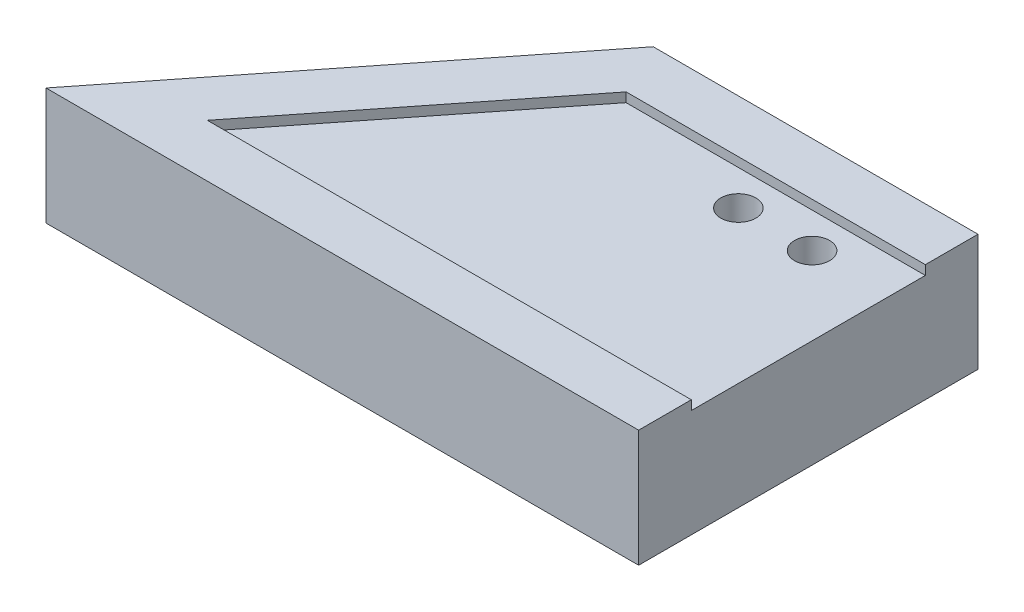
ISO-10303-21;
HEADER;
FILE_DESCRIPTION(('STEP AP214'),'2;1');
FILE_NAME('part.step','',(''),(''),'','','');
FILE_SCHEMA(('AUTOMOTIVE_DESIGN { 1 0 10303 214 1 1 1 1 }'));
ENDSEC;
DATA;
#1=APPLICATION_CONTEXT('core data for automotive mechanical design processes');
#2=APPLICATION_PROTOCOL_DEFINITION('international standard','automotive_design',2000,#1);
#3=PRODUCT_CONTEXT('',#1,'mechanical');
#4=PRODUCT('Part','Part','',(#3));
#5=PRODUCT_RELATED_PRODUCT_CATEGORY('part','',(#4));
#6=PRODUCT_DEFINITION_FORMATION('','',#4);
#7=PRODUCT_DEFINITION_CONTEXT('part definition',#1,'design');
#8=PRODUCT_DEFINITION('design','',#6,#7);
#9=PRODUCT_DEFINITION_SHAPE('','',#8);
#10=(LENGTH_UNIT() NAMED_UNIT(*) SI_UNIT(.MILLI.,.METRE.));
#11=(NAMED_UNIT(*) PLANE_ANGLE_UNIT() SI_UNIT($,.RADIAN.));
#12=(NAMED_UNIT(*) SI_UNIT($,.STERADIAN.) SOLID_ANGLE_UNIT());
#13=UNCERTAINTY_MEASURE_WITH_UNIT(LENGTH_MEASURE(1.E-05),#10,'distance_accuracy_value','');
#14=(GEOMETRIC_REPRESENTATION_CONTEXT(3) GLOBAL_UNCERTAINTY_ASSIGNED_CONTEXT((#13)) GLOBAL_UNIT_ASSIGNED_CONTEXT((#10,
#11,#12)) REPRESENTATION_CONTEXT('',''));
#15=CARTESIAN_POINT('',(0.,0.,0.));
#16=DIRECTION('',(0.,0.,1.));
#17=DIRECTION('',(1.,0.,0.));
#18=AXIS2_PLACEMENT_3D('',#15,#16,#17);
#19=CARTESIAN_POINT('',(0.,0.,0.));
#20=DIRECTION('',(0.,1.,0.));
#21=DIRECTION('',(0.,0.,1.));
#22=AXIS2_PLACEMENT_3D('',#19,#20,#21);
#23=PLANE('',#22);
#24=CARTESIAN_POINT('',(27.35,0.,-16.5));
#25=DIRECTION('',(0.,-1.,0.));
#26=DIRECTION('',(0.,0.,-1.));
#27=AXIS2_PLACEMENT_3D('',#24,#25,#26);
#28=CIRCLE('',#27,1.5);
#29=CARTESIAN_POINT('',(27.35,0.,-18.));
#30=VERTEX_POINT('',#29);
#31=EDGE_CURVE('E262',#30,#30,#28,.T.);
#32=ORIENTED_EDGE('',*,*,#31,.F.);
#33=EDGE_LOOP('',(#32));
#34=FACE_BOUND('',#33,.T.);
#35=CARTESIAN_POINT('',(33.65,0.,-16.5));
#36=DIRECTION('',(0.,-1.,0.));
#37=DIRECTION('',(0.,0.,-1.));
#38=AXIS2_PLACEMENT_3D('',#35,#36,#37);
#39=CIRCLE('',#38,1.5);
#40=CARTESIAN_POINT('',(33.65,0.,-18.));
#41=VERTEX_POINT('',#40);
#42=EDGE_CURVE('E261',#41,#41,#39,.T.);
#43=ORIENTED_EDGE('',*,*,#42,.F.);
#44=EDGE_LOOP('',(#43));
#45=FACE_BOUND('',#44,.T.);
#46=DIRECTION('',(-1.,0.,0.));
#47=VECTOR('',#46,1.);
#48=CARTESIAN_POINT('',(0.,0.,-24.));
#49=LINE('',#48,#47);
#50=CARTESIAN_POINT('',(40.3302122674418,0.,-24.));
#51=VERTEX_POINT('',#50);
#52=CARTESIAN_POINT('',(12.5769902963631,0.,-24.));
#53=VERTEX_POINT('',#52);
#54=EDGE_CURVE('E240',#51,#53,#49,.T.);
#55=ORIENTED_EDGE('',*,*,#54,.F.);
#56=DIRECTION('',(0.,0.,-1.));
#57=VECTOR('',#56,1.);
#58=CARTESIAN_POINT('',(40.3302122674418,0.,5.));
#59=LINE('',#58,#57);
#60=CARTESIAN_POINT('',(40.3302122674418,0.,5.));
#61=VERTEX_POINT('',#60);
#62=EDGE_CURVE('E254',#61,#51,#59,.T.);
#63=ORIENTED_EDGE('',*,*,#62,.F.);
#64=DIRECTION('',(1.,0.,0.));
#65=VECTOR('',#64,1.);
#66=CARTESIAN_POINT('',(0.,0.,5.));
#67=LINE('',#66,#65);
#68=CARTESIAN_POINT('',(-10.3177465457422,0.,5.));
#69=VERTEX_POINT('',#68);
#70=EDGE_CURVE('E225',#69,#61,#67,.T.);
#71=ORIENTED_EDGE('',*,*,#70,.F.);
#72=DIRECTION('',(-0.619644288579021,0.,0.784882765533426));
#73=VECTOR('',#72,1.);
#74=CARTESIAN_POINT('',(-3.92441382766714,0.,-3.09822144289511));
#75=LINE('',#74,#73);
#76=EDGE_CURVE('E242',#53,#69,#75,.T.);
#77=ORIENTED_EDGE('',*,*,#76,.F.);
#78=EDGE_LOOP('',(#55,#63,#71,#77));
#79=FACE_BOUND('',#78,.T.);
#80=ADVANCED_FACE('F142',(#34,#45,#79),#23,.F.);
#81=CARTESIAN_POINT('',(0.,10.,-24.));
#82=DIRECTION('',(0.,0.,1.));
#83=DIRECTION('',(1.,0.,0.));
#84=AXIS2_PLACEMENT_3D('',#81,#82,#83);
#85=PLANE('',#84);
#86=DIRECTION('',(-1.,0.,0.));
#87=VECTOR('',#86,1.);
#88=CARTESIAN_POINT('',(0.,10.,-24.));
#89=LINE('',#88,#87);
#90=CARTESIAN_POINT('',(40.3302122674418,10.,-24.));
#91=VERTEX_POINT('',#90);
#92=CARTESIAN_POINT('',(12.5769902963631,10.,-24.));
#93=VERTEX_POINT('',#92);
#94=EDGE_CURVE('E236',#91,#93,#89,.T.);
#95=ORIENTED_EDGE('',*,*,#94,.F.);
#96=DIRECTION('',(0.,-1.,0.));
#97=VECTOR('',#96,1.);
#98=CARTESIAN_POINT('',(40.3302122674418,10.,-24.));
#99=LINE('',#98,#97);
#100=EDGE_CURVE('E226',#91,#51,#99,.T.);
#101=ORIENTED_EDGE('',*,*,#100,.T.);
#102=ORIENTED_EDGE('',*,*,#54,.T.);
#103=DIRECTION('',(0.,-1.,0.));
#104=VECTOR('',#103,1.);
#105=CARTESIAN_POINT('',(12.5769902963631,10.,-24.));
#106=LINE('',#105,#104);
#107=EDGE_CURVE('E150',#93,#53,#106,.T.);
#108=ORIENTED_EDGE('',*,*,#107,.F.);
#109=EDGE_LOOP('',(#95,#101,#102,#108));
#110=FACE_BOUND('',#109,.T.);
#111=ADVANCED_FACE('F144',(#110),#85,.F.);
#112=CARTESIAN_POINT('',(-3.92441382766714,10.,-3.09822144289511));
#113=DIRECTION('',(0.784882765533426,0.,0.619644288579021));
#114=DIRECTION('',(0.619644288579021,0.,-0.784882765533426));
#115=AXIS2_PLACEMENT_3D('',#112,#113,#114);
#116=PLANE('',#115);
#117=ORIENTED_EDGE('',*,*,#76,.T.);
#118=DIRECTION('',(0.,-1.,0.));
#119=VECTOR('',#118,1.);
#120=CARTESIAN_POINT('',(-10.3177465457422,10.,5.));
#121=LINE('',#120,#119);
#122=CARTESIAN_POINT('',(-10.3177465457422,10.,5.));
#123=VERTEX_POINT('',#122);
#124=EDGE_CURVE('E233',#123,#69,#121,.T.);
#125=ORIENTED_EDGE('',*,*,#124,.F.);
#126=DIRECTION('',(-0.619644288579021,0.,0.784882765533426));
#127=VECTOR('',#126,1.);
#128=CARTESIAN_POINT('',(-3.92441382766714,10.,-3.09822144289511));
#129=LINE('',#128,#127);
#130=EDGE_CURVE('E231',#93,#123,#129,.T.);
#131=ORIENTED_EDGE('',*,*,#130,.F.);
#132=ORIENTED_EDGE('',*,*,#107,.T.);
#133=EDGE_LOOP('',(#117,#125,#131,#132));
#134=FACE_BOUND('',#133,.T.);
#135=ADVANCED_FACE('F249',(#134),#116,.F.);
#136=CARTESIAN_POINT('',(0.,10.,5.));
#137=DIRECTION('',(0.,0.,-1.));
#138=DIRECTION('',(-1.,0.,0.));
#139=AXIS2_PLACEMENT_3D('',#136,#137,#138);
#140=PLANE('',#139);
#141=ORIENTED_EDGE('',*,*,#70,.T.);
#142=DIRECTION('',(0.,-1.,0.));
#143=VECTOR('',#142,1.);
#144=CARTESIAN_POINT('',(40.3302122674418,10.,5.));
#145=LINE('',#144,#143);
#146=CARTESIAN_POINT('',(40.3302122674418,10.,5.));
#147=VERTEX_POINT('',#146);
#148=EDGE_CURVE('E208',#147,#61,#145,.T.);
#149=ORIENTED_EDGE('',*,*,#148,.F.);
#150=DIRECTION('',(1.,0.,0.));
#151=VECTOR('',#150,1.);
#152=CARTESIAN_POINT('',(0.,10.,5.));
#153=LINE('',#152,#151);
#154=EDGE_CURVE('E223',#123,#147,#153,.T.);
#155=ORIENTED_EDGE('',*,*,#154,.F.);
#156=ORIENTED_EDGE('',*,*,#124,.T.);
#157=EDGE_LOOP('',(#141,#149,#155,#156));
#158=FACE_BOUND('',#157,.T.);
#159=ADVANCED_FACE('F221',(#158),#140,.F.);
#160=CARTESIAN_POINT('',(0.,10.,0.));
#161=DIRECTION('',(0.,1.,0.));
#162=DIRECTION('',(0.,0.,1.));
#163=AXIS2_PLACEMENT_3D('',#160,#161,#162);
#164=PLANE('',#163);
#165=DIRECTION('',(0.,0.,-1.));
#166=VECTOR('',#165,1.);
#167=CARTESIAN_POINT('',(40.3302122674418,10.,5.));
#168=LINE('',#167,#166);
#169=CARTESIAN_POINT('',(40.3302122674418,10.,-19.5));
#170=VERTEX_POINT('',#169);
#171=EDGE_CURVE('E216',#170,#91,#168,.T.);
#172=ORIENTED_EDGE('',*,*,#171,.T.);
#173=ORIENTED_EDGE('',*,*,#94,.T.);
#174=ORIENTED_EDGE('',*,*,#130,.T.);
#175=ORIENTED_EDGE('',*,*,#154,.T.);
#176=CARTESIAN_POINT('',(40.3302122674418,10.,0.500000000000002));
#177=VERTEX_POINT('',#176);
#178=EDGE_CURVE('E205',#147,#177,#168,.T.);
#179=ORIENTED_EDGE('',*,*,#178,.T.);
#180=DIRECTION('',(1.,0.,0.));
#181=VECTOR('',#180,1.);
#182=CARTESIAN_POINT('',(0.,10.,0.5));
#183=LINE('',#182,#181);
#184=CARTESIAN_POINT('',(-1.03177465457422,10.,0.5));
#185=VERTEX_POINT('',#184);
#186=EDGE_CURVE('E276',#185,#177,#183,.T.);
#187=ORIENTED_EDGE('',*,*,#186,.F.);
#188=DIRECTION('',(-0.619644288579021,0.,0.784882765533426));
#189=VECTOR('',#188,1.);
#190=CARTESIAN_POINT('',(-0.392441382766711,10.,-0.309822144289508));
#191=LINE('',#190,#189);
#192=CARTESIAN_POINT('',(14.7576990296363,10.,-19.5));
#193=VERTEX_POINT('',#192);
#194=EDGE_CURVE('E284',#193,#185,#191,.T.);
#195=ORIENTED_EDGE('',*,*,#194,.F.);
#196=DIRECTION('',(-1.,0.,0.));
#197=VECTOR('',#196,1.);
#198=CARTESIAN_POINT('',(0.,10.,-19.5));
#199=LINE('',#198,#197);
#200=EDGE_CURVE('E163',#170,#193,#199,.T.);
#201=ORIENTED_EDGE('',*,*,#200,.F.);
#202=EDGE_LOOP('',(#172,#173,#174,#175,#179,#187,#195,#201));
#203=FACE_BOUND('',#202,.T.);
#204=ADVANCED_FACE('F229',(#203),#164,.T.);
#205=CARTESIAN_POINT('',(0.,9.2,-19.5));
#206=DIRECTION('',(0.,0.,-1.));
#207=DIRECTION('',(-1.,0.,0.));
#208=AXIS2_PLACEMENT_3D('',#205,#206,#207);
#209=PLANE('',#208);
#210=DIRECTION('',(-1.,0.,0.));
#211=VECTOR('',#210,1.);
#212=CARTESIAN_POINT('',(0.,9.2,-19.5));
#213=LINE('',#212,#211);
#214=CARTESIAN_POINT('',(40.3302122674418,9.2,-19.5));
#215=VERTEX_POINT('',#214);
#216=CARTESIAN_POINT('',(14.7576990296363,9.2,-19.5));
#217=VERTEX_POINT('',#216);
#218=EDGE_CURVE('E273',#215,#217,#213,.T.);
#219=ORIENTED_EDGE('',*,*,#218,.F.);
#220=DIRECTION('',(0.,1.,0.));
#221=VECTOR('',#220,1.);
#222=CARTESIAN_POINT('',(40.3302122674418,9.2,-19.5));
#223=LINE('',#222,#221);
#224=EDGE_CURVE('E156',#215,#170,#223,.T.);
#225=ORIENTED_EDGE('',*,*,#224,.T.);
#226=ORIENTED_EDGE('',*,*,#200,.T.);
#227=DIRECTION('',(0.,1.,0.));
#228=VECTOR('',#227,1.);
#229=CARTESIAN_POINT('',(14.7576990296363,9.2,-19.5));
#230=LINE('',#229,#228);
#231=EDGE_CURVE('E282',#217,#193,#230,.T.);
#232=ORIENTED_EDGE('',*,*,#231,.F.);
#233=EDGE_LOOP('',(#219,#225,#226,#232));
#234=FACE_BOUND('',#233,.T.);
#235=ADVANCED_FACE('F290',(#234),#209,.F.);
#236=CARTESIAN_POINT('',(0.,9.2,0.5));
#237=DIRECTION('',(0.,0.,1.));
#238=DIRECTION('',(1.,0.,0.));
#239=AXIS2_PLACEMENT_3D('',#236,#237,#238);
#240=PLANE('',#239);
#241=ORIENTED_EDGE('',*,*,#186,.T.);
#242=DIRECTION('',(0.,-1.,0.));
#243=VECTOR('',#242,1.);
#244=CARTESIAN_POINT('',(40.3302122674418,9.2,0.5));
#245=LINE('',#244,#243);
#246=CARTESIAN_POINT('',(40.3302122674418,9.2,0.500000000000004));
#247=VERTEX_POINT('',#246);
#248=EDGE_CURVE('E211',#177,#247,#245,.T.);
#249=ORIENTED_EDGE('',*,*,#248,.T.);
#250=DIRECTION('',(1.,0.,0.));
#251=VECTOR('',#250,1.);
#252=CARTESIAN_POINT('',(0.,9.2,0.5));
#253=LINE('',#252,#251);
#254=CARTESIAN_POINT('',(-1.03177465457422,9.2,0.5));
#255=VERTEX_POINT('',#254);
#256=EDGE_CURVE('E279',#255,#247,#253,.T.);
#257=ORIENTED_EDGE('',*,*,#256,.F.);
#258=DIRECTION('',(0.,1.,0.));
#259=VECTOR('',#258,1.);
#260=CARTESIAN_POINT('',(-1.03177465457422,9.2,0.5));
#261=LINE('',#260,#259);
#262=EDGE_CURVE('E243',#255,#185,#261,.T.);
#263=ORIENTED_EDGE('',*,*,#262,.T.);
#264=EDGE_LOOP('',(#241,#249,#257,#263));
#265=FACE_BOUND('',#264,.T.);
#266=ADVANCED_FACE('F300',(#265),#240,.F.);
#267=CARTESIAN_POINT('',(-0.392441382766711,9.2,-0.309822144289508));
#268=DIRECTION('',(-0.784882765533426,0.,-0.619644288579021));
#269=DIRECTION('',(-0.619644288579021,0.,0.784882765533426));
#270=AXIS2_PLACEMENT_3D('',#267,#268,#269);
#271=PLANE('',#270);
#272=ORIENTED_EDGE('',*,*,#194,.T.);
#273=ORIENTED_EDGE('',*,*,#262,.F.);
#274=DIRECTION('',(-0.619644288579021,0.,0.784882765533426));
#275=VECTOR('',#274,1.);
#276=CARTESIAN_POINT('',(-0.392441382766711,9.2,-0.309822144289508));
#277=LINE('',#276,#275);
#278=EDGE_CURVE('E275',#217,#255,#277,.T.);
#279=ORIENTED_EDGE('',*,*,#278,.F.);
#280=ORIENTED_EDGE('',*,*,#231,.T.);
#281=EDGE_LOOP('',(#272,#273,#279,#280));
#282=FACE_BOUND('',#281,.T.);
#283=ADVANCED_FACE('F293',(#282),#271,.F.);
#284=CARTESIAN_POINT('',(0.,9.2,0.));
#285=DIRECTION('',(0.,1.,0.));
#286=DIRECTION('',(0.,0.,1.));
#287=AXIS2_PLACEMENT_3D('',#284,#285,#286);
#288=PLANE('',#287);
#289=DIRECTION('',(0.,0.,1.));
#290=VECTOR('',#289,1.);
#291=CARTESIAN_POINT('',(40.3302122674418,9.2,0.));
#292=LINE('',#291,#290);
#293=EDGE_CURVE('E12',#215,#247,#292,.T.);
#294=ORIENTED_EDGE('',*,*,#293,.F.);
#295=ORIENTED_EDGE('',*,*,#218,.T.);
#296=ORIENTED_EDGE('',*,*,#278,.T.);
#297=ORIENTED_EDGE('',*,*,#256,.T.);
#298=EDGE_LOOP('',(#294,#295,#296,#297));
#299=FACE_BOUND('',#298,.T.);
#300=CARTESIAN_POINT('',(33.65,9.2,-16.5));
#301=DIRECTION('',(0.,1.,0.));
#302=DIRECTION('',(0.,0.,1.));
#303=AXIS2_PLACEMENT_3D('',#300,#301,#302);
#304=CIRCLE('',#303,1.5);
#305=CARTESIAN_POINT('',(33.65,9.2,-15.));
#306=VERTEX_POINT('',#305);
#307=EDGE_CURVE('E265',#306,#306,#304,.T.);
#308=ORIENTED_EDGE('',*,*,#307,.F.);
#309=EDGE_LOOP('',(#308));
#310=FACE_BOUND('',#309,.T.);
#311=CARTESIAN_POINT('',(27.35,9.2,-16.5));
#312=DIRECTION('',(0.,1.,0.));
#313=DIRECTION('',(0.,0.,1.));
#314=AXIS2_PLACEMENT_3D('',#311,#312,#313);
#315=CIRCLE('',#314,1.5);
#316=CARTESIAN_POINT('',(27.35,9.2,-15.));
#317=VERTEX_POINT('',#316);
#318=EDGE_CURVE('E270',#317,#317,#315,.T.);
#319=ORIENTED_EDGE('',*,*,#318,.F.);
#320=EDGE_LOOP('',(#319));
#321=FACE_BOUND('',#320,.T.);
#322=ADVANCED_FACE('F297',(#299,#310,#321),#288,.T.);
#323=CARTESIAN_POINT('',(33.65,15.,-16.5));
#324=DIRECTION('',(0.,-1.,0.));
#325=DIRECTION('',(0.,0.,-1.));
#326=AXIS2_PLACEMENT_3D('',#323,#324,#325);
#327=CYLINDRICAL_SURFACE('',#326,1.5);
#328=ORIENTED_EDGE('',*,*,#307,.T.);
#329=EDGE_LOOP('',(#328));
#330=FACE_BOUND('',#329,.T.);
#331=ORIENTED_EDGE('',*,*,#42,.T.);
#332=EDGE_LOOP('',(#331));
#333=FACE_BOUND('',#332,.T.);
#334=ADVANCED_FACE('F364',(#330,#333),#327,.F.);
#335=CARTESIAN_POINT('',(27.35,15.,-16.5));
#336=DIRECTION('',(0.,-1.,0.));
#337=DIRECTION('',(0.,0.,-1.));
#338=AXIS2_PLACEMENT_3D('',#335,#336,#337);
#339=CYLINDRICAL_SURFACE('',#338,1.5);
#340=ORIENTED_EDGE('',*,*,#318,.T.);
#341=EDGE_LOOP('',(#340));
#342=FACE_BOUND('',#341,.T.);
#343=ORIENTED_EDGE('',*,*,#31,.T.);
#344=EDGE_LOOP('',(#343));
#345=FACE_BOUND('',#344,.T.);
#346=ADVANCED_FACE('F372',(#342,#345),#339,.F.);
#347=CARTESIAN_POINT('',(40.3302122674418,10.,5.));
#348=DIRECTION('',(-1.,0.,0.));
#349=DIRECTION('',(0.,0.,1.));
#350=AXIS2_PLACEMENT_3D('',#347,#348,#349);
#351=PLANE('',#350);
#352=ORIENTED_EDGE('',*,*,#293,.T.);
#353=ORIENTED_EDGE('',*,*,#248,.F.);
#354=ORIENTED_EDGE('',*,*,#178,.F.);
#355=ORIENTED_EDGE('',*,*,#148,.T.);
#356=ORIENTED_EDGE('',*,*,#62,.T.);
#357=ORIENTED_EDGE('',*,*,#100,.F.);
#358=ORIENTED_EDGE('',*,*,#171,.F.);
#359=ORIENTED_EDGE('',*,*,#224,.F.);
#360=EDGE_LOOP('',(#352,#353,#354,#355,#356,#357,#358,#359));
#361=FACE_BOUND('',#360,.T.);
#362=ADVANCED_FACE('F207',(#361),#351,.F.);
#363=CLOSED_SHELL('',(#80,#111,#135,#159,#204,#235,#266,#283,#322,#334,#346,#362));
#364=MANIFOLD_SOLID_BREP('B2',#363);
#365=ADVANCED_BREP_SHAPE_REPRESENTATION('',(#18,#364),#14);
#366=SHAPE_DEFINITION_REPRESENTATION(#9,#365);
ENDSEC;
END-ISO-10303-21;
